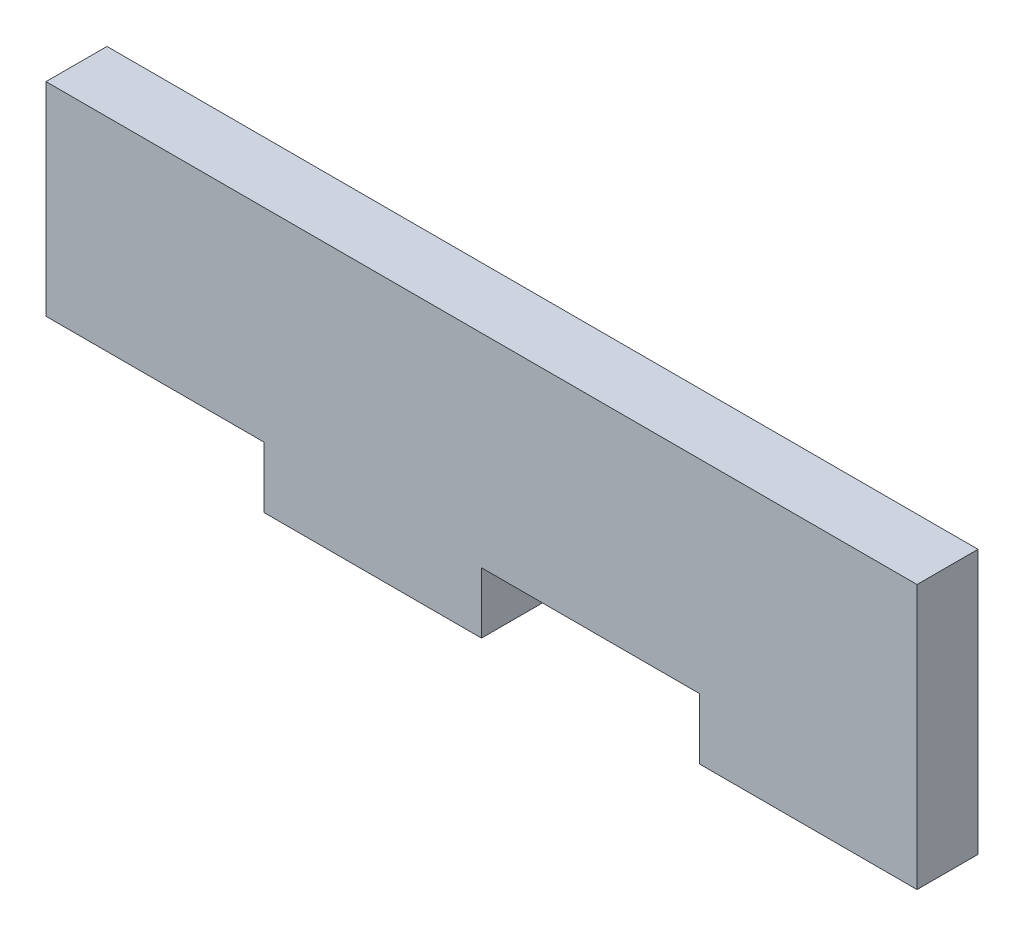
ISO-10303-21;
HEADER;
FILE_DESCRIPTION(('STEP AP214'),'2;1');
FILE_NAME('part.step','',(''),(''),'','','');
FILE_SCHEMA(('AUTOMOTIVE_DESIGN { 1 0 10303 214 1 1 1 1 }'));
ENDSEC;
DATA;
#1=APPLICATION_CONTEXT('core data for automotive mechanical design processes');
#2=APPLICATION_PROTOCOL_DEFINITION('international standard','automotive_design',2000,#1);
#3=PRODUCT_CONTEXT('',#1,'mechanical');
#4=PRODUCT('Part','Part','',(#3));
#5=PRODUCT_RELATED_PRODUCT_CATEGORY('part','',(#4));
#6=PRODUCT_DEFINITION_FORMATION('','',#4);
#7=PRODUCT_DEFINITION_CONTEXT('part definition',#1,'design');
#8=PRODUCT_DEFINITION('design','',#6,#7);
#9=PRODUCT_DEFINITION_SHAPE('','',#8);
#10=(LENGTH_UNIT() NAMED_UNIT(*) SI_UNIT(.MILLI.,.METRE.));
#11=(NAMED_UNIT(*) PLANE_ANGLE_UNIT() SI_UNIT($,.RADIAN.));
#12=(NAMED_UNIT(*) SI_UNIT($,.STERADIAN.) SOLID_ANGLE_UNIT());
#13=UNCERTAINTY_MEASURE_WITH_UNIT(LENGTH_MEASURE(1.E-05),#10,'distance_accuracy_value','');
#14=(GEOMETRIC_REPRESENTATION_CONTEXT(3) GLOBAL_UNCERTAINTY_ASSIGNED_CONTEXT((#13)) GLOBAL_UNIT_ASSIGNED_CONTEXT((#10,
#11,#12)) REPRESENTATION_CONTEXT('',''));
#15=CARTESIAN_POINT('',(0.,0.,0.));
#16=DIRECTION('',(0.,0.,1.));
#17=DIRECTION('',(1.,0.,0.));
#18=AXIS2_PLACEMENT_3D('',#15,#16,#17);
#19=CARTESIAN_POINT('',(-382.880730467029,262.631658780323,5.334));
#20=DIRECTION('',(0.,1.,0.));
#21=DIRECTION('',(0.,0.,1.));
#22=AXIS2_PLACEMENT_3D('',#19,#20,#21);
#23=PLANE('',#22);
#24=DIRECTION('',(1.,0.,0.));
#25=VECTOR('',#24,1.);
#26=CARTESIAN_POINT('',(-382.880730467029,262.631658780323,0.));
#27=LINE('',#26,#25);
#28=CARTESIAN_POINT('',(-363.830730467029,262.631658780323,0.));
#29=VERTEX_POINT('',#28);
#30=CARTESIAN_POINT('',(-344.780730467029,262.631658780323,0.));
#31=VERTEX_POINT('',#30);
#32=EDGE_CURVE('E128',#29,#31,#27,.T.);
#33=ORIENTED_EDGE('',*,*,#32,.T.);
#34=DIRECTION('',(0.,0.,1.));
#35=VECTOR('',#34,1.);
#36=CARTESIAN_POINT('',(-344.780730467029,262.631658780323,0.));
#37=LINE('',#36,#35);
#38=CARTESIAN_POINT('',(-344.780730467029,262.631658780323,5.334));
#39=VERTEX_POINT('',#38);
#40=EDGE_CURVE('E112',#31,#39,#37,.T.);
#41=ORIENTED_EDGE('',*,*,#40,.T.);
#42=DIRECTION('',(1.,0.,0.));
#43=VECTOR('',#42,1.);
#44=CARTESIAN_POINT('',(-382.880730467029,262.631658780323,5.334));
#45=LINE('',#44,#43);
#46=CARTESIAN_POINT('',(-363.830730467029,262.631658780323,5.334));
#47=VERTEX_POINT('',#46);
#48=EDGE_CURVE('E177',#47,#39,#45,.T.);
#49=ORIENTED_EDGE('',*,*,#48,.F.);
#50=DIRECTION('',(0.,0.,1.));
#51=VECTOR('',#50,1.);
#52=CARTESIAN_POINT('',(-363.830730467029,262.631658780323,0.));
#53=LINE('',#52,#51);
#54=EDGE_CURVE('E134',#29,#47,#53,.T.);
#55=ORIENTED_EDGE('',*,*,#54,.F.);
#56=EDGE_LOOP('',(#33,#41,#49,#55));
#57=FACE_BOUND('',#56,.T.);
#58=ADVANCED_FACE('F35',(#57),#23,.F.);
#59=CARTESIAN_POINT('',(-382.880730467029,285.745658780323,5.334));
#60=DIRECTION('',(1.,0.,0.));
#61=DIRECTION('',(0.,1.,0.));
#62=AXIS2_PLACEMENT_3D('',#59,#60,#61);
#63=PLANE('',#62);
#64=DIRECTION('',(0.,-1.,0.));
#65=VECTOR('',#64,1.);
#66=CARTESIAN_POINT('',(-382.880730467029,285.745658780323,0.));
#67=LINE('',#66,#65);
#68=CARTESIAN_POINT('',(-382.880730467029,285.745658780323,0.));
#69=VERTEX_POINT('',#68);
#70=CARTESIAN_POINT('',(-382.880730467029,267.965658780323,0.));
#71=VERTEX_POINT('',#70);
#72=EDGE_CURVE('E140',#69,#71,#67,.T.);
#73=ORIENTED_EDGE('',*,*,#72,.T.);
#74=DIRECTION('',(0.,0.,1.));
#75=VECTOR('',#74,1.);
#76=CARTESIAN_POINT('',(-382.880730467029,267.965658780323,0.));
#77=LINE('',#76,#75);
#78=CARTESIAN_POINT('',(-382.880730467029,267.965658780323,5.334));
#79=VERTEX_POINT('',#78);
#80=EDGE_CURVE('E164',#71,#79,#77,.T.);
#81=ORIENTED_EDGE('',*,*,#80,.T.);
#82=DIRECTION('',(0.,-1.,0.));
#83=VECTOR('',#82,1.);
#84=CARTESIAN_POINT('',(-382.880730467029,285.745658780323,5.334));
#85=LINE('',#84,#83);
#86=CARTESIAN_POINT('',(-382.880730467029,285.745658780323,5.334));
#87=VERTEX_POINT('',#86);
#88=EDGE_CURVE('E145',#87,#79,#85,.T.);
#89=ORIENTED_EDGE('',*,*,#88,.F.);
#90=DIRECTION('',(0.,0.,-1.));
#91=VECTOR('',#90,1.);
#92=CARTESIAN_POINT('',(-382.880730467029,285.745658780323,5.334));
#93=LINE('',#92,#91);
#94=EDGE_CURVE('E146',#87,#69,#93,.T.);
#95=ORIENTED_EDGE('',*,*,#94,.T.);
#96=EDGE_LOOP('',(#73,#81,#89,#95));
#97=FACE_BOUND('',#96,.T.);
#98=ADVANCED_FACE('F37',(#97),#63,.F.);
#99=CARTESIAN_POINT('',(-325.730730467029,262.631658780323,5.334));
#100=VERTEX_POINT('',#99);
#101=CARTESIAN_POINT('',(-306.680730467029,262.631658780323,5.334));
#102=VERTEX_POINT('',#101);
#103=EDGE_CURVE('E176',#100,#102,#45,.T.);
#104=ORIENTED_EDGE('',*,*,#103,.F.);
#105=DIRECTION('',(0.,0.,1.));
#106=VECTOR('',#105,1.);
#107=CARTESIAN_POINT('',(-325.730730467029,262.631658780323,0.));
#108=LINE('',#107,#106);
#109=CARTESIAN_POINT('',(-325.730730467029,262.631658780323,0.));
#110=VERTEX_POINT('',#109);
#111=EDGE_CURVE('E122',#110,#100,#108,.T.);
#112=ORIENTED_EDGE('',*,*,#111,.F.);
#113=CARTESIAN_POINT('',(-306.680730467029,262.631658780323,0.));
#114=VERTEX_POINT('',#113);
#115=EDGE_CURVE('E136',#110,#114,#27,.T.);
#116=ORIENTED_EDGE('',*,*,#115,.T.);
#117=DIRECTION('',(0.,0.,-1.));
#118=VECTOR('',#117,1.);
#119=CARTESIAN_POINT('',(-306.680730467029,262.631658780323,5.334));
#120=LINE('',#119,#118);
#121=EDGE_CURVE('E11',#102,#114,#120,.T.);
#122=ORIENTED_EDGE('',*,*,#121,.F.);
#123=EDGE_LOOP('',(#104,#112,#116,#122));
#124=FACE_BOUND('',#123,.T.);
#125=ADVANCED_FACE('F184',(#124),#23,.F.);
#126=CARTESIAN_POINT('',(-306.680730467029,285.745658780323,5.334));
#127=DIRECTION('',(-1.,0.,0.));
#128=DIRECTION('',(0.,0.,1.));
#129=AXIS2_PLACEMENT_3D('',#126,#127,#128);
#130=PLANE('',#129);
#131=DIRECTION('',(0.,1.,0.));
#132=VECTOR('',#131,1.);
#133=CARTESIAN_POINT('',(-306.680730467029,285.745658780323,0.));
#134=LINE('',#133,#132);
#135=CARTESIAN_POINT('',(-306.680730467029,285.745658780323,0.));
#136=VERTEX_POINT('',#135);
#137=EDGE_CURVE('E135',#114,#136,#134,.T.);
#138=ORIENTED_EDGE('',*,*,#137,.T.);
#139=DIRECTION('',(0.,0.,-1.));
#140=VECTOR('',#139,1.);
#141=CARTESIAN_POINT('',(-306.680730467029,285.745658780323,5.334));
#142=LINE('',#141,#140);
#143=CARTESIAN_POINT('',(-306.680730467029,285.745658780323,5.334));
#144=VERTEX_POINT('',#143);
#145=EDGE_CURVE('E43',#144,#136,#142,.T.);
#146=ORIENTED_EDGE('',*,*,#145,.F.);
#147=DIRECTION('',(0.,1.,0.));
#148=VECTOR('',#147,1.);
#149=CARTESIAN_POINT('',(-306.680730467029,285.745658780323,5.334));
#150=LINE('',#149,#148);
#151=EDGE_CURVE('E179',#102,#144,#150,.T.);
#152=ORIENTED_EDGE('',*,*,#151,.F.);
#153=ORIENTED_EDGE('',*,*,#121,.T.);
#154=EDGE_LOOP('',(#138,#146,#152,#153));
#155=FACE_BOUND('',#154,.T.);
#156=ADVANCED_FACE('F189',(#155),#130,.F.);
#157=CARTESIAN_POINT('',(-382.880730467029,285.745658780323,5.334));
#158=DIRECTION('',(0.,-1.,0.));
#159=DIRECTION('',(0.,0.,-1.));
#160=AXIS2_PLACEMENT_3D('',#157,#158,#159);
#161=PLANE('',#160);
#162=DIRECTION('',(-1.,0.,0.));
#163=VECTOR('',#162,1.);
#164=CARTESIAN_POINT('',(-382.880730467029,285.745658780323,0.));
#165=LINE('',#164,#163);
#166=EDGE_CURVE('E138',#136,#69,#165,.T.);
#167=ORIENTED_EDGE('',*,*,#166,.T.);
#168=ORIENTED_EDGE('',*,*,#94,.F.);
#169=DIRECTION('',(-1.,0.,0.));
#170=VECTOR('',#169,1.);
#171=CARTESIAN_POINT('',(-382.880730467029,285.745658780323,5.334));
#172=LINE('',#171,#170);
#173=EDGE_CURVE('E148',#144,#87,#172,.T.);
#174=ORIENTED_EDGE('',*,*,#173,.F.);
#175=ORIENTED_EDGE('',*,*,#145,.T.);
#176=EDGE_LOOP('',(#167,#168,#174,#175));
#177=FACE_BOUND('',#176,.T.);
#178=ADVANCED_FACE('F154',(#177),#161,.F.);
#179=CARTESIAN_POINT('',(0.,0.,5.334));
#180=DIRECTION('',(0.,0.,1.));
#181=DIRECTION('',(1.,0.,0.));
#182=AXIS2_PLACEMENT_3D('',#179,#180,#181);
#183=PLANE('',#182);
#184=DIRECTION('',(0.,-1.,0.));
#185=VECTOR('',#184,1.);
#186=CARTESIAN_POINT('',(-344.780730467029,262.631658780323,5.334));
#187=LINE('',#186,#185);
#188=CARTESIAN_POINT('',(-344.780730467029,267.965658780323,5.334));
#189=VERTEX_POINT('',#188);
#190=EDGE_CURVE('E117',#189,#39,#187,.T.);
#191=ORIENTED_EDGE('',*,*,#190,.F.);
#192=DIRECTION('',(-1.,0.,0.));
#193=VECTOR('',#192,1.);
#194=CARTESIAN_POINT('',(-344.780730467029,267.965658780323,5.334));
#195=LINE('',#194,#193);
#196=CARTESIAN_POINT('',(-325.730730467029,267.965658780323,5.334));
#197=VERTEX_POINT('',#196);
#198=EDGE_CURVE('E131',#197,#189,#195,.T.);
#199=ORIENTED_EDGE('',*,*,#198,.F.);
#200=DIRECTION('',(0.,1.,0.));
#201=VECTOR('',#200,1.);
#202=CARTESIAN_POINT('',(-325.730730467029,262.631658780323,5.334));
#203=LINE('',#202,#201);
#204=EDGE_CURVE('E225',#100,#197,#203,.T.);
#205=ORIENTED_EDGE('',*,*,#204,.F.);
#206=ORIENTED_EDGE('',*,*,#103,.T.);
#207=ORIENTED_EDGE('',*,*,#151,.T.);
#208=ORIENTED_EDGE('',*,*,#173,.T.);
#209=ORIENTED_EDGE('',*,*,#88,.T.);
#210=DIRECTION('',(-1.,0.,0.));
#211=VECTOR('',#210,1.);
#212=CARTESIAN_POINT('',(-382.880730467029,267.965658780323,5.334));
#213=LINE('',#212,#211);
#214=CARTESIAN_POINT('',(-363.830730467029,267.965658780323,5.334));
#215=VERTEX_POINT('',#214);
#216=EDGE_CURVE('E171',#215,#79,#213,.T.);
#217=ORIENTED_EDGE('',*,*,#216,.F.);
#218=DIRECTION('',(0.,1.,0.));
#219=VECTOR('',#218,1.);
#220=CARTESIAN_POINT('',(-363.830730467029,262.631658780323,5.334));
#221=LINE('',#220,#219);
#222=EDGE_CURVE('E234',#47,#215,#221,.T.);
#223=ORIENTED_EDGE('',*,*,#222,.F.);
#224=ORIENTED_EDGE('',*,*,#48,.T.);
#225=EDGE_LOOP('',(#191,#199,#205,#206,#207,#208,#209,#217,#223,#224));
#226=FACE_BOUND('',#225,.T.);
#227=ADVANCED_FACE('F181',(#226),#183,.T.);
#228=CARTESIAN_POINT('',(0.,0.,0.));
#229=DIRECTION('',(0.,0.,1.));
#230=DIRECTION('',(1.,0.,0.));
#231=AXIS2_PLACEMENT_3D('',#228,#229,#230);
#232=PLANE('',#231);
#233=DIRECTION('',(-1.,0.,0.));
#234=VECTOR('',#233,1.);
#235=CARTESIAN_POINT('',(-344.780730467029,267.965658780323,0.));
#236=LINE('',#235,#234);
#237=CARTESIAN_POINT('',(-325.730730467029,267.965658780323,0.));
#238=VERTEX_POINT('',#237);
#239=CARTESIAN_POINT('',(-344.780730467029,267.965658780323,0.));
#240=VERTEX_POINT('',#239);
#241=EDGE_CURVE('E50',#238,#240,#236,.T.);
#242=ORIENTED_EDGE('',*,*,#241,.T.);
#243=DIRECTION('',(0.,-1.,0.));
#244=VECTOR('',#243,1.);
#245=CARTESIAN_POINT('',(-344.780730467029,262.631658780323,0.));
#246=LINE('',#245,#244);
#247=EDGE_CURVE('E115',#240,#31,#246,.T.);
#248=ORIENTED_EDGE('',*,*,#247,.T.);
#249=ORIENTED_EDGE('',*,*,#32,.F.);
#250=DIRECTION('',(0.,1.,0.));
#251=VECTOR('',#250,1.);
#252=CARTESIAN_POINT('',(-363.830730467029,262.631658780323,0.));
#253=LINE('',#252,#251);
#254=CARTESIAN_POINT('',(-363.830730467029,267.965658780323,0.));
#255=VERTEX_POINT('',#254);
#256=EDGE_CURVE('E237',#29,#255,#253,.T.);
#257=ORIENTED_EDGE('',*,*,#256,.T.);
#258=DIRECTION('',(-1.,0.,0.));
#259=VECTOR('',#258,1.);
#260=CARTESIAN_POINT('',(-382.880730467029,267.965658780323,0.));
#261=LINE('',#260,#259);
#262=EDGE_CURVE('E58',#255,#71,#261,.T.);
#263=ORIENTED_EDGE('',*,*,#262,.T.);
#264=ORIENTED_EDGE('',*,*,#72,.F.);
#265=ORIENTED_EDGE('',*,*,#166,.F.);
#266=ORIENTED_EDGE('',*,*,#137,.F.);
#267=ORIENTED_EDGE('',*,*,#115,.F.);
#268=DIRECTION('',(0.,1.,0.));
#269=VECTOR('',#268,1.);
#270=CARTESIAN_POINT('',(-325.730730467029,262.631658780323,0.));
#271=LINE('',#270,#269);
#272=EDGE_CURVE('E130',#110,#238,#271,.T.);
#273=ORIENTED_EDGE('',*,*,#272,.T.);
#274=EDGE_LOOP('',(#242,#248,#249,#257,#263,#264,#265,#266,#267,#273));
#275=FACE_BOUND('',#274,.T.);
#276=ADVANCED_FACE('F126',(#275),#232,.F.);
#277=CARTESIAN_POINT('',(-382.880730467029,267.965658780323,0.));
#278=DIRECTION('',(0.,1.,0.));
#279=DIRECTION('',(0.,0.,1.));
#280=AXIS2_PLACEMENT_3D('',#277,#278,#279);
#281=PLANE('',#280);
#282=ORIENTED_EDGE('',*,*,#216,.T.);
#283=ORIENTED_EDGE('',*,*,#80,.F.);
#284=ORIENTED_EDGE('',*,*,#262,.F.);
#285=DIRECTION('',(0.,0.,1.));
#286=VECTOR('',#285,1.);
#287=CARTESIAN_POINT('',(-363.830730467029,267.965658780323,0.));
#288=LINE('',#287,#286);
#289=EDGE_CURVE('E165',#255,#215,#288,.T.);
#290=ORIENTED_EDGE('',*,*,#289,.T.);
#291=EDGE_LOOP('',(#282,#283,#284,#290));
#292=FACE_BOUND('',#291,.T.);
#293=ADVANCED_FACE('F200',(#292),#281,.F.);
#294=CARTESIAN_POINT('',(-363.830730467029,262.631658780323,0.));
#295=DIRECTION('',(1.,0.,0.));
#296=DIRECTION('',(0.,0.,-1.));
#297=AXIS2_PLACEMENT_3D('',#294,#295,#296);
#298=PLANE('',#297);
#299=ORIENTED_EDGE('',*,*,#222,.T.);
#300=ORIENTED_EDGE('',*,*,#289,.F.);
#301=ORIENTED_EDGE('',*,*,#256,.F.);
#302=ORIENTED_EDGE('',*,*,#54,.T.);
#303=EDGE_LOOP('',(#299,#300,#301,#302));
#304=FACE_BOUND('',#303,.T.);
#305=ADVANCED_FACE('F203',(#304),#298,.F.);
#306=CARTESIAN_POINT('',(-344.780730467029,262.631658780323,0.));
#307=DIRECTION('',(-1.,0.,0.));
#308=DIRECTION('',(0.,0.,1.));
#309=AXIS2_PLACEMENT_3D('',#306,#307,#308);
#310=PLANE('',#309);
#311=ORIENTED_EDGE('',*,*,#190,.T.);
#312=ORIENTED_EDGE('',*,*,#40,.F.);
#313=ORIENTED_EDGE('',*,*,#247,.F.);
#314=DIRECTION('',(0.,0.,1.));
#315=VECTOR('',#314,1.);
#316=CARTESIAN_POINT('',(-344.780730467029,267.965658780323,0.));
#317=LINE('',#316,#315);
#318=EDGE_CURVE('E221',#240,#189,#317,.T.);
#319=ORIENTED_EDGE('',*,*,#318,.T.);
#320=EDGE_LOOP('',(#311,#312,#313,#319));
#321=FACE_BOUND('',#320,.T.);
#322=ADVANCED_FACE('F114',(#321),#310,.F.);
#323=CARTESIAN_POINT('',(-344.780730467029,267.965658780323,0.));
#324=DIRECTION('',(0.,1.,0.));
#325=DIRECTION('',(0.,0.,1.));
#326=AXIS2_PLACEMENT_3D('',#323,#324,#325);
#327=PLANE('',#326);
#328=ORIENTED_EDGE('',*,*,#198,.T.);
#329=ORIENTED_EDGE('',*,*,#318,.F.);
#330=ORIENTED_EDGE('',*,*,#241,.F.);
#331=DIRECTION('',(0.,0.,1.));
#332=VECTOR('',#331,1.);
#333=CARTESIAN_POINT('',(-325.730730467029,267.965658780323,0.));
#334=LINE('',#333,#332);
#335=EDGE_CURVE('E222',#238,#197,#334,.T.);
#336=ORIENTED_EDGE('',*,*,#335,.T.);
#337=EDGE_LOOP('',(#328,#329,#330,#336));
#338=FACE_BOUND('',#337,.T.);
#339=ADVANCED_FACE('F211',(#338),#327,.F.);
#340=CARTESIAN_POINT('',(-325.730730467029,262.631658780323,0.));
#341=DIRECTION('',(1.,0.,0.));
#342=DIRECTION('',(0.,0.,-1.));
#343=AXIS2_PLACEMENT_3D('',#340,#341,#342);
#344=PLANE('',#343);
#345=ORIENTED_EDGE('',*,*,#204,.T.);
#346=ORIENTED_EDGE('',*,*,#335,.F.);
#347=ORIENTED_EDGE('',*,*,#272,.F.);
#348=ORIENTED_EDGE('',*,*,#111,.T.);
#349=EDGE_LOOP('',(#345,#346,#347,#348));
#350=FACE_BOUND('',#349,.T.);
#351=ADVANCED_FACE('F212',(#350),#344,.F.);
#352=CLOSED_SHELL('',(#58,#98,#125,#156,#178,#227,#276,#293,#305,#322,#339,#351));
#353=MANIFOLD_SOLID_BREP('B2',#352);
#354=ADVANCED_BREP_SHAPE_REPRESENTATION('',(#18,#353),#14);
#355=SHAPE_DEFINITION_REPRESENTATION(#9,#354);
ENDSEC;
END-ISO-10303-21;
